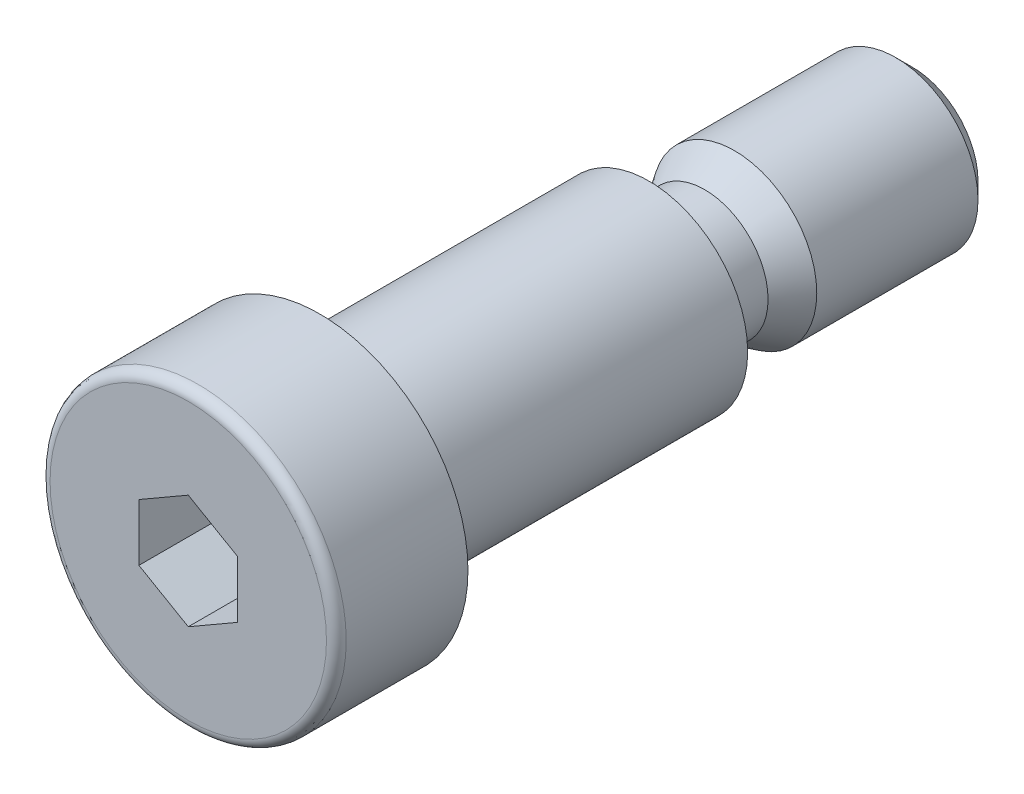
ISO-10303-21;
HEADER;
FILE_DESCRIPTION(('STEP AP214'),'2;1');
FILE_NAME('part.step','',(''),(''),'','','');
FILE_SCHEMA(('AUTOMOTIVE_DESIGN { 1 0 10303 214 1 1 1 1 }'));
ENDSEC;
DATA;
#1=APPLICATION_CONTEXT('core data for automotive mechanical design processes');
#2=APPLICATION_PROTOCOL_DEFINITION('international standard','automotive_design',2000,#1);
#3=PRODUCT_CONTEXT('',#1,'mechanical');
#4=PRODUCT('Part','Part','',(#3));
#5=PRODUCT_RELATED_PRODUCT_CATEGORY('part','',(#4));
#6=PRODUCT_DEFINITION_FORMATION('','',#4);
#7=PRODUCT_DEFINITION_CONTEXT('part definition',#1,'design');
#8=PRODUCT_DEFINITION('design','',#6,#7);
#9=PRODUCT_DEFINITION_SHAPE('','',#8);
#10=(LENGTH_UNIT() NAMED_UNIT(*) SI_UNIT(.MILLI.,.METRE.));
#11=(NAMED_UNIT(*) PLANE_ANGLE_UNIT() SI_UNIT($,.RADIAN.));
#12=(NAMED_UNIT(*) SI_UNIT($,.STERADIAN.) SOLID_ANGLE_UNIT());
#13=UNCERTAINTY_MEASURE_WITH_UNIT(LENGTH_MEASURE(1.E-05),#10,'distance_accuracy_value','');
#14=(GEOMETRIC_REPRESENTATION_CONTEXT(3) GLOBAL_UNCERTAINTY_ASSIGNED_CONTEXT((#13)) GLOBAL_UNIT_ASSIGNED_CONTEXT((#10,
#11,#12)) REPRESENTATION_CONTEXT('',''));
#15=CARTESIAN_POINT('',(0.,0.,0.));
#16=DIRECTION('',(0.,0.,1.));
#17=DIRECTION('',(1.,0.,0.));
#18=AXIS2_PLACEMENT_3D('',#15,#16,#17);
#19=CARTESIAN_POINT('',(0.,0.,18.));
#20=DIRECTION('',(0.,0.,1.));
#21=DIRECTION('',(1.,0.,0.));
#22=AXIS2_PLACEMENT_3D('',#19,#20,#21);
#23=PLANE('',#22);
#24=CARTESIAN_POINT('',(0.,0.,18.));
#25=DIRECTION('',(0.,0.,1.));
#26=DIRECTION('',(1.,0.,0.));
#27=AXIS2_PLACEMENT_3D('',#24,#25,#26);
#28=CIRCLE('',#27,8.4);
#29=CARTESIAN_POINT('',(8.4,0.,18.));
#30=VERTEX_POINT('',#29);
#31=EDGE_CURVE('E42',#30,#30,#28,.T.);
#32=ORIENTED_EDGE('',*,*,#31,.T.);
#33=EDGE_LOOP('',(#32));
#34=FACE_BOUND('',#33,.T.);
#35=DIRECTION('',(0.,1.,0.));
#36=VECTOR('',#35,1.);
#37=CARTESIAN_POINT('',(3.,-1.73205080756888,18.));
#38=LINE('',#37,#36);
#39=CARTESIAN_POINT('',(3.,-1.73205080756888,18.));
#40=VERTEX_POINT('',#39);
#41=CARTESIAN_POINT('',(3.,1.73205080756888,18.));
#42=VERTEX_POINT('',#41);
#43=EDGE_CURVE('E49',#40,#42,#38,.T.);
#44=ORIENTED_EDGE('',*,*,#43,.F.);
#45=DIRECTION('',(0.866025403784439,0.5,0.));
#46=VECTOR('',#45,1.);
#47=CARTESIAN_POINT('',(0.,-3.46410161513775,18.));
#48=LINE('',#47,#46);
#49=CARTESIAN_POINT('',(0.,-3.46410161513775,18.));
#50=VERTEX_POINT('',#49);
#51=EDGE_CURVE('E132',#50,#40,#48,.T.);
#52=ORIENTED_EDGE('',*,*,#51,.F.);
#53=DIRECTION('',(0.866025403784439,-0.5,0.));
#54=VECTOR('',#53,1.);
#55=CARTESIAN_POINT('',(-3.,-1.73205080756888,18.));
#56=LINE('',#55,#54);
#57=CARTESIAN_POINT('',(-3.,-1.73205080756888,18.));
#58=VERTEX_POINT('',#57);
#59=EDGE_CURVE('E130',#58,#50,#56,.T.);
#60=ORIENTED_EDGE('',*,*,#59,.F.);
#61=DIRECTION('',(0.,-1.,0.));
#62=VECTOR('',#61,1.);
#63=CARTESIAN_POINT('',(-3.,1.73205080756888,18.));
#64=LINE('',#63,#62);
#65=CARTESIAN_POINT('',(-3.,1.73205080756888,18.));
#66=VERTEX_POINT('',#65);
#67=EDGE_CURVE('E97',#66,#58,#64,.T.);
#68=ORIENTED_EDGE('',*,*,#67,.F.);
#69=DIRECTION('',(-0.866025403784439,-0.5,0.));
#70=VECTOR('',#69,1.);
#71=CARTESIAN_POINT('',(0.,3.46410161513775,18.));
#72=LINE('',#71,#70);
#73=CARTESIAN_POINT('',(0.,3.46410161513775,18.));
#74=VERTEX_POINT('',#73);
#75=EDGE_CURVE('E126',#74,#66,#72,.T.);
#76=ORIENTED_EDGE('',*,*,#75,.F.);
#77=DIRECTION('',(-0.866025403784439,0.5,0.));
#78=VECTOR('',#77,1.);
#79=CARTESIAN_POINT('',(3.,1.73205080756888,18.));
#80=LINE('',#79,#78);
#81=EDGE_CURVE('E123',#42,#74,#80,.T.);
#82=ORIENTED_EDGE('',*,*,#81,.F.);
#83=EDGE_LOOP('',(#44,#52,#60,#68,#76,#82));
#84=FACE_BOUND('',#83,.T.);
#85=ADVANCED_FACE('F34',(#34,#84),#23,.T.);
#86=CARTESIAN_POINT('',(0.,0.,-26.));
#87=DIRECTION('',(0.,0.,1.));
#88=DIRECTION('',(1.,0.,0.));
#89=AXIS2_PLACEMENT_3D('',#86,#87,#88);
#90=PLANE('',#89);
#91=CARTESIAN_POINT('',(0.,0.,-26.));
#92=DIRECTION('',(0.,0.,1.));
#93=DIRECTION('',(1.,0.,0.));
#94=AXIS2_PLACEMENT_3D('',#91,#92,#93);
#95=CIRCLE('',#94,4.);
#96=CARTESIAN_POINT('',(4.,0.,-26.));
#97=VERTEX_POINT('',#96);
#98=EDGE_CURVE('E162',#97,#97,#95,.T.);
#99=ORIENTED_EDGE('',*,*,#98,.F.);
#100=EDGE_LOOP('',(#99));
#101=FACE_BOUND('',#100,.T.);
#102=ADVANCED_FACE('F178',(#101),#90,.F.);
#103=CARTESIAN_POINT('',(0.,0.,-26.));
#104=DIRECTION('',(0.,0.,1.));
#105=DIRECTION('',(1.,0.,0.));
#106=AXIS2_PLACEMENT_3D('',#103,#104,#105);
#107=CONICAL_SURFACE('',#106,4.,0.785398163397448);
#108=CARTESIAN_POINT('',(0.,0.,-25.));
#109=DIRECTION('',(0.,0.,1.));
#110=DIRECTION('',(1.,0.,0.));
#111=AXIS2_PLACEMENT_3D('',#108,#109,#110);
#112=CIRCLE('',#111,5.);
#113=CARTESIAN_POINT('',(5.,0.,-25.));
#114=VERTEX_POINT('',#113);
#115=EDGE_CURVE('E159',#114,#114,#112,.T.);
#116=ORIENTED_EDGE('',*,*,#115,.F.);
#117=EDGE_LOOP('',(#116));
#118=FACE_BOUND('',#117,.T.);
#119=ORIENTED_EDGE('',*,*,#98,.T.);
#120=EDGE_LOOP('',(#119));
#121=FACE_BOUND('',#120,.T.);
#122=ADVANCED_FACE('F182',(#118,#121),#107,.T.);
#123=CARTESIAN_POINT('',(0.,0.,18.));
#124=DIRECTION('',(0.,0.,1.));
#125=DIRECTION('',(1.,0.,0.));
#126=AXIS2_PLACEMENT_3D('',#123,#124,#125);
#127=CYLINDRICAL_SURFACE('',#126,5.);
#128=CARTESIAN_POINT('',(0.,0.,-15.2));
#129=DIRECTION('',(0.,0.,1.));
#130=DIRECTION('',(1.,0.,0.));
#131=AXIS2_PLACEMENT_3D('',#128,#129,#130);
#132=CIRCLE('',#131,5.);
#133=CARTESIAN_POINT('',(5.,0.,-15.2));
#134=VERTEX_POINT('',#133);
#135=EDGE_CURVE('E156',#134,#134,#132,.T.);
#136=ORIENTED_EDGE('',*,*,#135,.F.);
#137=EDGE_LOOP('',(#136));
#138=FACE_BOUND('',#137,.T.);
#139=ORIENTED_EDGE('',*,*,#115,.T.);
#140=EDGE_LOOP('',(#139));
#141=FACE_BOUND('',#140,.T.);
#142=ADVANCED_FACE('F188',(#138,#141),#127,.T.);
#143=CARTESIAN_POINT('',(0.,0.,-15.2));
#144=DIRECTION('',(0.,0.,-1.));
#145=DIRECTION('',(-1.,0.,0.));
#146=AXIS2_PLACEMENT_3D('',#143,#144,#145);
#147=CONICAL_SURFACE('',#146,5.,0.566013910063241);
#148=CARTESIAN_POINT('',(0.,0.,-13.39));
#149=DIRECTION('',(0.,0.,1.));
#150=DIRECTION('',(1.,0.,0.));
#151=AXIS2_PLACEMENT_3D('',#148,#149,#150);
#152=CIRCLE('',#151,3.85);
#153=CARTESIAN_POINT('',(3.85,0.,-13.39));
#154=VERTEX_POINT('',#153);
#155=EDGE_CURVE('E153',#154,#154,#152,.T.);
#156=ORIENTED_EDGE('',*,*,#155,.F.);
#157=EDGE_LOOP('',(#156));
#158=FACE_BOUND('',#157,.T.);
#159=ORIENTED_EDGE('',*,*,#135,.T.);
#160=EDGE_LOOP('',(#159));
#161=FACE_BOUND('',#160,.T.);
#162=ADVANCED_FACE('F192',(#158,#161),#147,.T.);
#163=CARTESIAN_POINT('',(0.,0.,18.));
#164=DIRECTION('',(0.,0.,1.));
#165=DIRECTION('',(1.,0.,0.));
#166=AXIS2_PLACEMENT_3D('',#163,#164,#165);
#167=CYLINDRICAL_SURFACE('',#166,3.85);
#168=ORIENTED_EDGE('',*,*,#155,.T.);
#169=EDGE_LOOP('',(#168));
#170=FACE_BOUND('',#169,.T.);
#171=CARTESIAN_POINT('',(0.,0.,-10.));
#172=DIRECTION('',(0.,0.,1.));
#173=DIRECTION('',(1.,0.,0.));
#174=AXIS2_PLACEMENT_3D('',#171,#172,#173);
#175=CIRCLE('',#174,3.85);
#176=CARTESIAN_POINT('',(3.85,0.,-10.));
#177=VERTEX_POINT('',#176);
#178=EDGE_CURVE('E150',#177,#177,#175,.T.);
#179=ORIENTED_EDGE('',*,*,#178,.F.);
#180=EDGE_LOOP('',(#179));
#181=FACE_BOUND('',#180,.T.);
#182=ADVANCED_FACE('F196',(#170,#181),#167,.T.);
#183=CARTESIAN_POINT('',(0.,0.,-10.));
#184=DIRECTION('',(0.,0.,1.));
#185=DIRECTION('',(1.,0.,0.));
#186=AXIS2_PLACEMENT_3D('',#183,#184,#185);
#187=PLANE('',#186);
#188=CARTESIAN_POINT('',(0.,0.,-10.));
#189=DIRECTION('',(0.,0.,1.));
#190=DIRECTION('',(1.,0.,0.));
#191=AXIS2_PLACEMENT_3D('',#188,#189,#190);
#192=CIRCLE('',#191,6.);
#193=CARTESIAN_POINT('',(6.,0.,-10.));
#194=VERTEX_POINT('',#193);
#195=EDGE_CURVE('E147',#194,#194,#192,.T.);
#196=ORIENTED_EDGE('',*,*,#195,.F.);
#197=EDGE_LOOP('',(#196));
#198=FACE_BOUND('',#197,.T.);
#199=ORIENTED_EDGE('',*,*,#178,.T.);
#200=EDGE_LOOP('',(#199));
#201=FACE_BOUND('',#200,.T.);
#202=ADVANCED_FACE('F200',(#198,#201),#187,.F.);
#203=CARTESIAN_POINT('',(0.,0.,18.));
#204=DIRECTION('',(0.,0.,1.));
#205=DIRECTION('',(1.,0.,0.));
#206=AXIS2_PLACEMENT_3D('',#203,#204,#205);
#207=CYLINDRICAL_SURFACE('',#206,6.);
#208=ORIENTED_EDGE('',*,*,#195,.T.);
#209=EDGE_LOOP('',(#208));
#210=FACE_BOUND('',#209,.T.);
#211=CARTESIAN_POINT('',(0.,0.,10.));
#212=DIRECTION('',(0.,0.,1.));
#213=DIRECTION('',(1.,0.,0.));
#214=AXIS2_PLACEMENT_3D('',#211,#212,#213);
#215=CIRCLE('',#214,6.);
#216=CARTESIAN_POINT('',(6.,0.,10.));
#217=VERTEX_POINT('',#216);
#218=EDGE_CURVE('E144',#217,#217,#215,.T.);
#219=ORIENTED_EDGE('',*,*,#218,.F.);
#220=EDGE_LOOP('',(#219));
#221=FACE_BOUND('',#220,.T.);
#222=ADVANCED_FACE('F204',(#210,#221),#207,.T.);
#223=CARTESIAN_POINT('',(0.,0.,10.));
#224=DIRECTION('',(0.,0.,1.));
#225=DIRECTION('',(1.,0.,0.));
#226=AXIS2_PLACEMENT_3D('',#223,#224,#225);
#227=PLANE('',#226);
#228=CARTESIAN_POINT('',(0.,0.,10.));
#229=DIRECTION('',(0.,0.,1.));
#230=DIRECTION('',(1.,0.,0.));
#231=AXIS2_PLACEMENT_3D('',#228,#229,#230);
#232=CIRCLE('',#231,9.);
#233=CARTESIAN_POINT('',(9.,0.,10.));
#234=VERTEX_POINT('',#233);
#235=EDGE_CURVE('E136',#234,#234,#232,.T.);
#236=ORIENTED_EDGE('',*,*,#235,.F.);
#237=EDGE_LOOP('',(#236));
#238=FACE_BOUND('',#237,.T.);
#239=ORIENTED_EDGE('',*,*,#218,.T.);
#240=EDGE_LOOP('',(#239));
#241=FACE_BOUND('',#240,.T.);
#242=ADVANCED_FACE('F208',(#238,#241),#227,.F.);
#243=CARTESIAN_POINT('',(0.,0.,18.));
#244=DIRECTION('',(0.,0.,1.));
#245=DIRECTION('',(1.,0.,0.));
#246=AXIS2_PLACEMENT_3D('',#243,#244,#245);
#247=CYLINDRICAL_SURFACE('',#246,9.);
#248=CARTESIAN_POINT('',(0.,0.,17.4));
#249=DIRECTION('',(0.,0.,1.));
#250=DIRECTION('',(1.,0.,0.));
#251=AXIS2_PLACEMENT_3D('',#248,#249,#250);
#252=CIRCLE('',#251,9.);
#253=CARTESIAN_POINT('',(9.,0.,17.4));
#254=VERTEX_POINT('',#253);
#255=EDGE_CURVE('E11',#254,#254,#252,.F.);
#256=ORIENTED_EDGE('',*,*,#255,.T.);
#257=EDGE_LOOP('',(#256));
#258=FACE_BOUND('',#257,.T.);
#259=ORIENTED_EDGE('',*,*,#235,.T.);
#260=EDGE_LOOP('',(#259));
#261=FACE_BOUND('',#260,.T.);
#262=ADVANCED_FACE('F212',(#258,#261),#247,.T.);
#263=CARTESIAN_POINT('',(3.,-1.73205080756888,13.1));
#264=DIRECTION('',(1.,0.,0.));
#265=DIRECTION('',(0.,1.,0.));
#266=AXIS2_PLACEMENT_3D('',#263,#264,#265);
#267=PLANE('',#266);
#268=ORIENTED_EDGE('',*,*,#43,.T.);
#269=DIRECTION('',(0.,0.,1.));
#270=VECTOR('',#269,1.);
#271=CARTESIAN_POINT('',(3.,1.73205080756888,13.1));
#272=LINE('',#271,#270);
#273=CARTESIAN_POINT('',(3.,1.73205080756888,13.1));
#274=VERTEX_POINT('',#273);
#275=EDGE_CURVE('E79',#274,#42,#272,.T.);
#276=ORIENTED_EDGE('',*,*,#275,.F.);
#277=DIRECTION('',(0.,1.,0.));
#278=VECTOR('',#277,1.);
#279=CARTESIAN_POINT('',(3.,-1.73205080756888,13.1));
#280=LINE('',#279,#278);
#281=CARTESIAN_POINT('',(3.,-1.73205080756888,13.1));
#282=VERTEX_POINT('',#281);
#283=EDGE_CURVE('E134',#282,#274,#280,.T.);
#284=ORIENTED_EDGE('',*,*,#283,.F.);
#285=DIRECTION('',(0.,0.,1.));
#286=VECTOR('',#285,1.);
#287=CARTESIAN_POINT('',(3.,-1.73205080756888,13.1));
#288=LINE('',#287,#286);
#289=EDGE_CURVE('E57',#282,#40,#288,.T.);
#290=ORIENTED_EDGE('',*,*,#289,.T.);
#291=EDGE_LOOP('',(#268,#276,#284,#290));
#292=FACE_BOUND('',#291,.T.);
#293=ADVANCED_FACE('F216',(#292),#267,.F.);
#294=CARTESIAN_POINT('',(0.,-3.46410161513775,13.1));
#295=DIRECTION('',(0.5,-0.866025403784439,0.));
#296=DIRECTION('',(0.866025403784439,0.5,0.));
#297=AXIS2_PLACEMENT_3D('',#294,#295,#296);
#298=PLANE('',#297);
#299=ORIENTED_EDGE('',*,*,#51,.T.);
#300=ORIENTED_EDGE('',*,*,#289,.F.);
#301=DIRECTION('',(0.866025403784439,0.5,0.));
#302=VECTOR('',#301,1.);
#303=CARTESIAN_POINT('',(0.,-3.46410161513775,13.1));
#304=LINE('',#303,#302);
#305=CARTESIAN_POINT('',(0.,-3.46410161513775,13.1));
#306=VERTEX_POINT('',#305);
#307=EDGE_CURVE('E109',#306,#282,#304,.T.);
#308=ORIENTED_EDGE('',*,*,#307,.F.);
#309=DIRECTION('',(0.,0.,1.));
#310=VECTOR('',#309,1.);
#311=CARTESIAN_POINT('',(0.,-3.46410161513775,13.1));
#312=LINE('',#311,#310);
#313=EDGE_CURVE('E101',#306,#50,#312,.T.);
#314=ORIENTED_EDGE('',*,*,#313,.T.);
#315=EDGE_LOOP('',(#299,#300,#308,#314));
#316=FACE_BOUND('',#315,.T.);
#317=ADVANCED_FACE('F220',(#316),#298,.F.);
#318=CARTESIAN_POINT('',(-3.,-1.73205080756888,13.1));
#319=DIRECTION('',(-0.5,-0.866025403784439,0.));
#320=DIRECTION('',(0.866025403784439,-0.5,0.));
#321=AXIS2_PLACEMENT_3D('',#318,#319,#320);
#322=PLANE('',#321);
#323=ORIENTED_EDGE('',*,*,#59,.T.);
#324=ORIENTED_EDGE('',*,*,#313,.F.);
#325=DIRECTION('',(0.866025403784439,-0.5,0.));
#326=VECTOR('',#325,1.);
#327=CARTESIAN_POINT('',(-3.,-1.73205080756888,13.1));
#328=LINE('',#327,#326);
#329=CARTESIAN_POINT('',(-3.,-1.73205080756888,13.1));
#330=VERTEX_POINT('',#329);
#331=EDGE_CURVE('E105',#330,#306,#328,.T.);
#332=ORIENTED_EDGE('',*,*,#331,.F.);
#333=DIRECTION('',(0.,0.,1.));
#334=VECTOR('',#333,1.);
#335=CARTESIAN_POINT('',(-3.,-1.73205080756888,13.1));
#336=LINE('',#335,#334);
#337=EDGE_CURVE('E90',#330,#58,#336,.T.);
#338=ORIENTED_EDGE('',*,*,#337,.T.);
#339=EDGE_LOOP('',(#323,#324,#332,#338));
#340=FACE_BOUND('',#339,.T.);
#341=ADVANCED_FACE('F106',(#340),#322,.F.);
#342=CARTESIAN_POINT('',(-3.,1.73205080756888,13.1));
#343=DIRECTION('',(-1.,0.,0.));
#344=DIRECTION('',(0.,0.,1.));
#345=AXIS2_PLACEMENT_3D('',#342,#343,#344);
#346=PLANE('',#345);
#347=ORIENTED_EDGE('',*,*,#67,.T.);
#348=ORIENTED_EDGE('',*,*,#337,.F.);
#349=DIRECTION('',(0.,-1.,0.));
#350=VECTOR('',#349,1.);
#351=CARTESIAN_POINT('',(-3.,1.73205080756888,13.1));
#352=LINE('',#351,#350);
#353=CARTESIAN_POINT('',(-3.,1.73205080756888,13.1));
#354=VERTEX_POINT('',#353);
#355=EDGE_CURVE('E94',#354,#330,#352,.T.);
#356=ORIENTED_EDGE('',*,*,#355,.F.);
#357=DIRECTION('',(0.,0.,1.));
#358=VECTOR('',#357,1.);
#359=CARTESIAN_POINT('',(-3.,1.73205080756888,13.1));
#360=LINE('',#359,#358);
#361=EDGE_CURVE('E102',#354,#66,#360,.T.);
#362=ORIENTED_EDGE('',*,*,#361,.T.);
#363=EDGE_LOOP('',(#347,#348,#356,#362));
#364=FACE_BOUND('',#363,.T.);
#365=ADVANCED_FACE('F92',(#364),#346,.F.);
#366=CARTESIAN_POINT('',(0.,3.46410161513775,13.1));
#367=DIRECTION('',(-0.5,0.866025403784439,0.));
#368=DIRECTION('',(-0.866025403784439,-0.5,0.));
#369=AXIS2_PLACEMENT_3D('',#366,#367,#368);
#370=PLANE('',#369);
#371=ORIENTED_EDGE('',*,*,#75,.T.);
#372=ORIENTED_EDGE('',*,*,#361,.F.);
#373=DIRECTION('',(-0.866025403784439,-0.5,0.));
#374=VECTOR('',#373,1.);
#375=CARTESIAN_POINT('',(0.,3.46410161513775,13.1));
#376=LINE('',#375,#374);
#377=CARTESIAN_POINT('',(0.,3.46410161513775,13.1));
#378=VERTEX_POINT('',#377);
#379=EDGE_CURVE('E115',#378,#354,#376,.T.);
#380=ORIENTED_EDGE('',*,*,#379,.F.);
#381=DIRECTION('',(0.,0.,1.));
#382=VECTOR('',#381,1.);
#383=CARTESIAN_POINT('',(0.,3.46410161513775,13.1));
#384=LINE('',#383,#382);
#385=EDGE_CURVE('E139',#378,#74,#384,.T.);
#386=ORIENTED_EDGE('',*,*,#385,.T.);
#387=EDGE_LOOP('',(#371,#372,#380,#386));
#388=FACE_BOUND('',#387,.T.);
#389=ADVANCED_FACE('F223',(#388),#370,.F.);
#390=CARTESIAN_POINT('',(3.,1.73205080756888,13.1));
#391=DIRECTION('',(0.5,0.866025403784439,0.));
#392=DIRECTION('',(-0.866025403784439,0.5,0.));
#393=AXIS2_PLACEMENT_3D('',#390,#391,#392);
#394=PLANE('',#393);
#395=ORIENTED_EDGE('',*,*,#81,.T.);
#396=ORIENTED_EDGE('',*,*,#385,.F.);
#397=DIRECTION('',(-0.866025403784439,0.5,0.));
#398=VECTOR('',#397,1.);
#399=CARTESIAN_POINT('',(3.,1.73205080756888,13.1));
#400=LINE('',#399,#398);
#401=EDGE_CURVE('E117',#274,#378,#400,.T.);
#402=ORIENTED_EDGE('',*,*,#401,.F.);
#403=ORIENTED_EDGE('',*,*,#275,.T.);
#404=EDGE_LOOP('',(#395,#396,#402,#403));
#405=FACE_BOUND('',#404,.T.);
#406=ADVANCED_FACE('F174',(#405),#394,.F.);
#407=CARTESIAN_POINT('',(0.,0.,13.1));
#408=DIRECTION('',(0.,0.,1.));
#409=DIRECTION('',(1.,0.,0.));
#410=AXIS2_PLACEMENT_3D('',#407,#408,#409);
#411=PLANE('',#410);
#412=ORIENTED_EDGE('',*,*,#283,.T.);
#413=ORIENTED_EDGE('',*,*,#401,.T.);
#414=ORIENTED_EDGE('',*,*,#379,.T.);
#415=ORIENTED_EDGE('',*,*,#355,.T.);
#416=ORIENTED_EDGE('',*,*,#331,.T.);
#417=ORIENTED_EDGE('',*,*,#307,.T.);
#418=EDGE_LOOP('',(#412,#413,#414,#415,#416,#417));
#419=FACE_BOUND('',#418,.T.);
#420=ADVANCED_FACE('F112',(#419),#411,.T.);
#421=CARTESIAN_POINT('',(0.,0.,17.4));
#422=DIRECTION('',(0.,0.,1.));
#423=DIRECTION('',(1.,0.,0.));
#424=AXIS2_PLACEMENT_3D('',#421,#422,#423);
#425=TOROIDAL_SURFACE('',#424,8.4,0.6);
#426=ORIENTED_EDGE('',*,*,#255,.F.);
#427=EDGE_LOOP('',(#426));
#428=FACE_BOUND('',#427,.T.);
#429=ORIENTED_EDGE('',*,*,#31,.F.);
#430=EDGE_LOOP('',(#429));
#431=FACE_BOUND('',#430,.T.);
#432=ADVANCED_FACE('F36',(#428,#431),#425,.T.);
#433=CLOSED_SHELL('',(#85,#102,#122,#142,#162,#182,#202,#222,#242,#262,#293,#317,#341,#365,#389,
#406,#420,#432));
#434=MANIFOLD_SOLID_BREP('B2',#433);
#435=ADVANCED_BREP_SHAPE_REPRESENTATION('',(#18,#434),#14);
#436=SHAPE_DEFINITION_REPRESENTATION(#9,#435);
ENDSEC;
END-ISO-10303-21;
